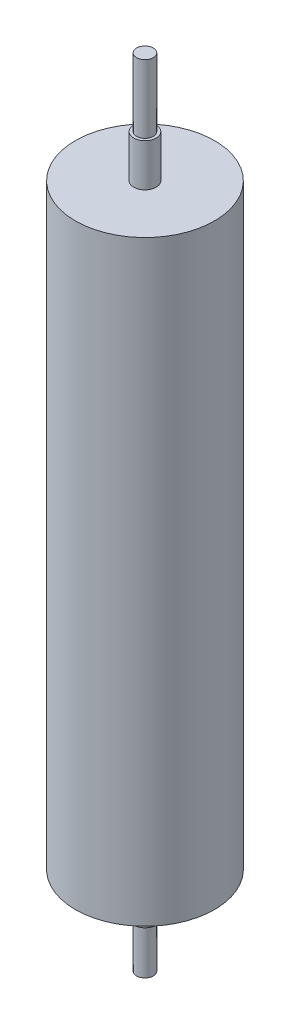
ISO-10303-21;
HEADER;
FILE_DESCRIPTION(('STEP AP214'),'2;1');
FILE_NAME('part.step','',(''),(''),'','','');
FILE_SCHEMA(('AUTOMOTIVE_DESIGN { 1 0 10303 214 1 1 1 1 }'));
ENDSEC;
DATA;
#1=APPLICATION_CONTEXT('core data for automotive mechanical design processes');
#2=APPLICATION_PROTOCOL_DEFINITION('international standard','automotive_design',2000,#1);
#3=PRODUCT_CONTEXT('',#1,'mechanical');
#4=PRODUCT('Part','Part','',(#3));
#5=PRODUCT_RELATED_PRODUCT_CATEGORY('part','',(#4));
#6=PRODUCT_DEFINITION_FORMATION('','',#4);
#7=PRODUCT_DEFINITION_CONTEXT('part definition',#1,'design');
#8=PRODUCT_DEFINITION('design','',#6,#7);
#9=PRODUCT_DEFINITION_SHAPE('','',#8);
#10=(LENGTH_UNIT() NAMED_UNIT(*) SI_UNIT(.MILLI.,.METRE.));
#11=(NAMED_UNIT(*) PLANE_ANGLE_UNIT() SI_UNIT($,.RADIAN.));
#12=(NAMED_UNIT(*) SI_UNIT($,.STERADIAN.) SOLID_ANGLE_UNIT());
#13=UNCERTAINTY_MEASURE_WITH_UNIT(LENGTH_MEASURE(1.E-05),#10,'distance_accuracy_value','');
#14=(GEOMETRIC_REPRESENTATION_CONTEXT(3) GLOBAL_UNCERTAINTY_ASSIGNED_CONTEXT((#13)) GLOBAL_UNIT_ASSIGNED_CONTEXT((#10,
#11,#12)) REPRESENTATION_CONTEXT('',''));
#15=CARTESIAN_POINT('',(0.,0.,0.));
#16=DIRECTION('',(0.,0.,1.));
#17=DIRECTION('',(1.,0.,0.));
#18=AXIS2_PLACEMENT_3D('',#15,#16,#17);
#19=CARTESIAN_POINT('',(0.,210.,0.));
#20=DIRECTION('',(0.,-1.,0.));
#21=DIRECTION('',(0.,0.,-1.));
#22=AXIS2_PLACEMENT_3D('',#19,#20,#21);
#23=CYLINDRICAL_SURFACE('',#22,24.5);
#24=CARTESIAN_POINT('',(0.,210.,0.));
#25=DIRECTION('',(0.,1.,0.));
#26=DIRECTION('',(0.,0.,1.));
#27=AXIS2_PLACEMENT_3D('',#24,#25,#26);
#28=CIRCLE('',#27,24.5);
#29=CARTESIAN_POINT('',(0.,210.,24.5));
#30=VERTEX_POINT('',#29);
#31=EDGE_CURVE('E53',#30,#30,#28,.T.);
#32=ORIENTED_EDGE('',*,*,#31,.F.);
#33=EDGE_LOOP('',(#32));
#34=FACE_BOUND('',#33,.T.);
#35=CARTESIAN_POINT('',(0.,0.,0.));
#36=DIRECTION('',(0.,1.,0.));
#37=DIRECTION('',(0.,0.,1.));
#38=AXIS2_PLACEMENT_3D('',#35,#36,#37);
#39=CIRCLE('',#38,24.5);
#40=CARTESIAN_POINT('',(0.,0.,24.5));
#41=VERTEX_POINT('',#40);
#42=EDGE_CURVE('E42',#41,#41,#39,.T.);
#43=ORIENTED_EDGE('',*,*,#42,.T.);
#44=EDGE_LOOP('',(#43));
#45=FACE_BOUND('',#44,.T.);
#46=ADVANCED_FACE('F39',(#34,#45),#23,.T.);
#47=CARTESIAN_POINT('',(0.,210.,0.));
#48=DIRECTION('',(0.,1.,0.));
#49=DIRECTION('',(0.,0.,1.));
#50=AXIS2_PLACEMENT_3D('',#47,#48,#49);
#51=PLANE('',#50);
#52=CARTESIAN_POINT('',(0.,210.,0.));
#53=DIRECTION('',(0.,1.,0.));
#54=DIRECTION('',(0.,0.,1.));
#55=AXIS2_PLACEMENT_3D('',#52,#53,#54);
#56=CIRCLE('',#55,3.95);
#57=CARTESIAN_POINT('',(0.,210.,3.95));
#58=VERTEX_POINT('',#57);
#59=EDGE_CURVE('E47',#58,#58,#56,.T.);
#60=ORIENTED_EDGE('',*,*,#59,.F.);
#61=EDGE_LOOP('',(#60));
#62=FACE_BOUND('',#61,.T.);
#63=ORIENTED_EDGE('',*,*,#31,.T.);
#64=EDGE_LOOP('',(#63));
#65=FACE_BOUND('',#64,.T.);
#66=ADVANCED_FACE('F89',(#62,#65),#51,.T.);
#67=CARTESIAN_POINT('',(0.,0.,0.));
#68=DIRECTION('',(0.,1.,0.));
#69=DIRECTION('',(0.,0.,1.));
#70=AXIS2_PLACEMENT_3D('',#67,#68,#69);
#71=PLANE('',#70);
#72=CARTESIAN_POINT('',(0.,0.,0.));
#73=DIRECTION('',(0.,1.,0.));
#74=DIRECTION('',(0.,0.,1.));
#75=AXIS2_PLACEMENT_3D('',#72,#73,#74);
#76=CIRCLE('',#75,3.95);
#77=CARTESIAN_POINT('',(0.,0.,3.95));
#78=VERTEX_POINT('',#77);
#79=EDGE_CURVE('E67',#78,#78,#76,.T.);
#80=ORIENTED_EDGE('',*,*,#79,.T.);
#81=EDGE_LOOP('',(#80));
#82=FACE_BOUND('',#81,.T.);
#83=ORIENTED_EDGE('',*,*,#42,.F.);
#84=EDGE_LOOP('',(#83));
#85=FACE_BOUND('',#84,.T.);
#86=ADVANCED_FACE('F86',(#82,#85),#71,.F.);
#87=CARTESIAN_POINT('',(0.,-15.,0.));
#88=DIRECTION('',(0.,1.,0.));
#89=DIRECTION('',(0.,0.,1.));
#90=AXIS2_PLACEMENT_3D('',#87,#88,#89);
#91=CYLINDRICAL_SURFACE('',#90,3.95);
#92=CARTESIAN_POINT('',(0.,-15.,0.));
#93=DIRECTION('',(0.,1.,0.));
#94=DIRECTION('',(0.,0.,1.));
#95=AXIS2_PLACEMENT_3D('',#92,#93,#94);
#96=CIRCLE('',#95,3.95);
#97=CARTESIAN_POINT('',(0.,-15.,3.95));
#98=VERTEX_POINT('',#97);
#99=EDGE_CURVE('E71',#98,#98,#96,.T.);
#100=ORIENTED_EDGE('',*,*,#99,.T.);
#101=EDGE_LOOP('',(#100));
#102=FACE_BOUND('',#101,.T.);
#103=ORIENTED_EDGE('',*,*,#79,.F.);
#104=EDGE_LOOP('',(#103));
#105=FACE_BOUND('',#104,.T.);
#106=ADVANCED_FACE('F88',(#102,#105),#91,.T.);
#107=CARTESIAN_POINT('',(0.,-15.,0.));
#108=DIRECTION('',(0.,1.,0.));
#109=DIRECTION('',(0.,0.,1.));
#110=AXIS2_PLACEMENT_3D('',#107,#108,#109);
#111=PLANE('',#110);
#112=CARTESIAN_POINT('',(0.,-15.,0.));
#113=DIRECTION('',(0.,1.,0.));
#114=DIRECTION('',(0.,0.,1.));
#115=AXIS2_PLACEMENT_3D('',#112,#113,#114);
#116=CIRCLE('',#115,2.95);
#117=CARTESIAN_POINT('',(0.,-15.,2.95));
#118=VERTEX_POINT('',#117);
#119=EDGE_CURVE('E61',#118,#118,#116,.T.);
#120=ORIENTED_EDGE('',*,*,#119,.T.);
#121=EDGE_LOOP('',(#120));
#122=FACE_BOUND('',#121,.T.);
#123=ORIENTED_EDGE('',*,*,#99,.F.);
#124=EDGE_LOOP('',(#123));
#125=FACE_BOUND('',#124,.T.);
#126=ADVANCED_FACE('F95',(#122,#125),#111,.F.);
#127=CARTESIAN_POINT('',(0.,-31.,0.));
#128=DIRECTION('',(0.,1.,0.));
#129=DIRECTION('',(0.,0.,1.));
#130=AXIS2_PLACEMENT_3D('',#127,#128,#129);
#131=CYLINDRICAL_SURFACE('',#130,2.95);
#132=CARTESIAN_POINT('',(0.,-31.,0.));
#133=DIRECTION('',(0.,1.,0.));
#134=DIRECTION('',(0.,0.,1.));
#135=AXIS2_PLACEMENT_3D('',#132,#133,#134);
#136=CIRCLE('',#135,2.95);
#137=CARTESIAN_POINT('',(0.,-31.,2.95));
#138=VERTEX_POINT('',#137);
#139=EDGE_CURVE('E63',#138,#138,#136,.T.);
#140=ORIENTED_EDGE('',*,*,#139,.T.);
#141=EDGE_LOOP('',(#140));
#142=FACE_BOUND('',#141,.T.);
#143=ORIENTED_EDGE('',*,*,#119,.F.);
#144=EDGE_LOOP('',(#143));
#145=FACE_BOUND('',#144,.T.);
#146=ADVANCED_FACE('F162',(#142,#145),#131,.T.);
#147=CARTESIAN_POINT('',(0.,-31.,0.));
#148=DIRECTION('',(0.,1.,0.));
#149=DIRECTION('',(0.,0.,1.));
#150=AXIS2_PLACEMENT_3D('',#147,#148,#149);
#151=PLANE('',#150);
#152=ORIENTED_EDGE('',*,*,#139,.F.);
#153=EDGE_LOOP('',(#152));
#154=FACE_BOUND('',#153,.T.);
#155=ADVANCED_FACE('F115',(#154),#151,.F.);
#156=CARTESIAN_POINT('',(0.,225.,0.));
#157=DIRECTION('',(0.,-1.,0.));
#158=DIRECTION('',(0.,0.,-1.));
#159=AXIS2_PLACEMENT_3D('',#156,#157,#158);
#160=CYLINDRICAL_SURFACE('',#159,3.95);
#161=CARTESIAN_POINT('',(0.,225.,0.));
#162=DIRECTION('',(0.,1.,0.));
#163=DIRECTION('',(0.,0.,1.));
#164=AXIS2_PLACEMENT_3D('',#161,#162,#163);
#165=CIRCLE('',#164,3.95);
#166=CARTESIAN_POINT('',(0.,225.,3.95));
#167=VERTEX_POINT('',#166);
#168=EDGE_CURVE('E58',#167,#167,#165,.T.);
#169=ORIENTED_EDGE('',*,*,#168,.F.);
#170=EDGE_LOOP('',(#169));
#171=FACE_BOUND('',#170,.T.);
#172=ORIENTED_EDGE('',*,*,#59,.T.);
#173=EDGE_LOOP('',(#172));
#174=FACE_BOUND('',#173,.T.);
#175=ADVANCED_FACE('F120',(#171,#174),#160,.T.);
#176=CARTESIAN_POINT('',(0.,225.,0.));
#177=DIRECTION('',(0.,1.,0.));
#178=DIRECTION('',(0.,0.,1.));
#179=AXIS2_PLACEMENT_3D('',#176,#177,#178);
#180=PLANE('',#179);
#181=CARTESIAN_POINT('',(0.,225.,0.));
#182=DIRECTION('',(0.,1.,0.));
#183=DIRECTION('',(0.,0.,1.));
#184=AXIS2_PLACEMENT_3D('',#181,#182,#183);
#185=CIRCLE('',#184,2.95);
#186=CARTESIAN_POINT('',(0.,225.,2.95));
#187=VERTEX_POINT('',#186);
#188=EDGE_CURVE('E10',#187,#187,#185,.T.);
#189=ORIENTED_EDGE('',*,*,#188,.F.);
#190=EDGE_LOOP('',(#189));
#191=FACE_BOUND('',#190,.T.);
#192=ORIENTED_EDGE('',*,*,#168,.T.);
#193=EDGE_LOOP('',(#192));
#194=FACE_BOUND('',#193,.T.);
#195=ADVANCED_FACE('F125',(#191,#194),#180,.T.);
#196=CARTESIAN_POINT('',(0.,249.,0.));
#197=DIRECTION('',(0.,-1.,0.));
#198=DIRECTION('',(0.,0.,-1.));
#199=AXIS2_PLACEMENT_3D('',#196,#197,#198);
#200=CYLINDRICAL_SURFACE('',#199,2.95);
#201=CARTESIAN_POINT('',(0.,249.,0.));
#202=DIRECTION('',(0.,1.,0.));
#203=DIRECTION('',(0.,0.,1.));
#204=AXIS2_PLACEMENT_3D('',#201,#202,#203);
#205=CIRCLE('',#204,2.95);
#206=CARTESIAN_POINT('',(0.,249.,2.95));
#207=VERTEX_POINT('',#206);
#208=EDGE_CURVE('E57',#207,#207,#205,.T.);
#209=ORIENTED_EDGE('',*,*,#208,.F.);
#210=EDGE_LOOP('',(#209));
#211=FACE_BOUND('',#210,.T.);
#212=ORIENTED_EDGE('',*,*,#188,.T.);
#213=EDGE_LOOP('',(#212));
#214=FACE_BOUND('',#213,.T.);
#215=ADVANCED_FACE('F135',(#211,#214),#200,.T.);
#216=CARTESIAN_POINT('',(0.,249.,0.));
#217=DIRECTION('',(0.,1.,0.));
#218=DIRECTION('',(0.,0.,1.));
#219=AXIS2_PLACEMENT_3D('',#216,#217,#218);
#220=PLANE('',#219);
#221=ORIENTED_EDGE('',*,*,#208,.T.);
#222=EDGE_LOOP('',(#221));
#223=FACE_BOUND('',#222,.T.);
#224=ADVANCED_FACE('F145',(#223),#220,.T.);
#225=CLOSED_SHELL('',(#46,#66,#86,#106,#126,#146,#155,#175,#195,#215,#224));
#226=MANIFOLD_SOLID_BREP('B2',#225);
#227=ADVANCED_BREP_SHAPE_REPRESENTATION('',(#18,#226),#14);
#228=SHAPE_DEFINITION_REPRESENTATION(#9,#227);
ENDSEC;
END-ISO-10303-21;
